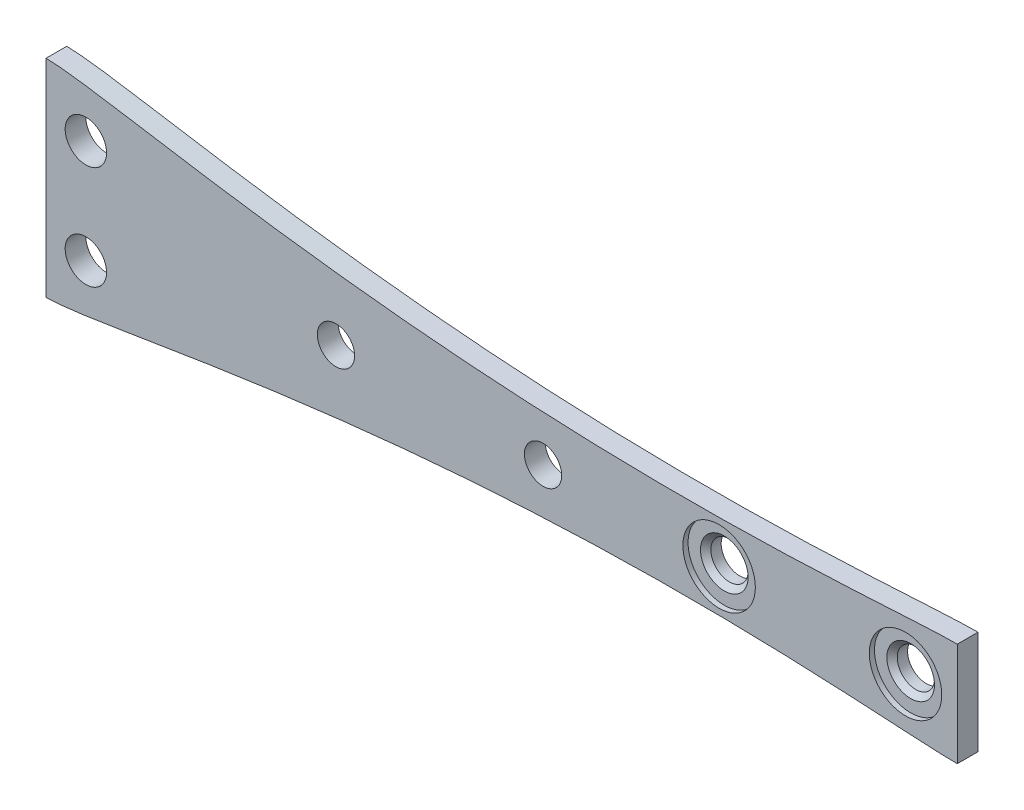
ISO-10303-21;
HEADER;
FILE_DESCRIPTION(('STEP AP214'),'2;1');
FILE_NAME('part.step','',(''),(''),'','','');
FILE_SCHEMA(('AUTOMOTIVE_DESIGN { 1 0 10303 214 1 1 1 1 }'));
ENDSEC;
DATA;
#1=APPLICATION_CONTEXT('core data for automotive mechanical design processes');
#2=APPLICATION_PROTOCOL_DEFINITION('international standard','automotive_design',2000,#1);
#3=PRODUCT_CONTEXT('',#1,'mechanical');
#4=PRODUCT('Part','Part','',(#3));
#5=PRODUCT_RELATED_PRODUCT_CATEGORY('part','',(#4));
#6=PRODUCT_DEFINITION_FORMATION('','',#4);
#7=PRODUCT_DEFINITION_CONTEXT('part definition',#1,'design');
#8=PRODUCT_DEFINITION('design','',#6,#7);
#9=PRODUCT_DEFINITION_SHAPE('','',#8);
#10=(LENGTH_UNIT() NAMED_UNIT(*) SI_UNIT(.MILLI.,.METRE.));
#11=(NAMED_UNIT(*) PLANE_ANGLE_UNIT() SI_UNIT($,.RADIAN.));
#12=(NAMED_UNIT(*) SI_UNIT($,.STERADIAN.) SOLID_ANGLE_UNIT());
#13=UNCERTAINTY_MEASURE_WITH_UNIT(LENGTH_MEASURE(1.E-05),#10,'distance_accuracy_value','');
#14=(GEOMETRIC_REPRESENTATION_CONTEXT(3) GLOBAL_UNCERTAINTY_ASSIGNED_CONTEXT((#13)) GLOBAL_UNIT_ASSIGNED_CONTEXT((#10,
#11,#12)) REPRESENTATION_CONTEXT('',''));
#15=CARTESIAN_POINT('',(0.,0.,0.));
#16=DIRECTION('',(0.,0.,1.));
#17=DIRECTION('',(1.,0.,0.));
#18=AXIS2_PLACEMENT_3D('',#15,#16,#17);
#19=CARTESIAN_POINT('',(65.,10.,2.));
#20=DIRECTION('',(0.,0.,-1.));
#21=DIRECTION('',(-1.,0.,0.));
#22=AXIS2_PLACEMENT_3D('',#19,#20,#21);
#23=CYLINDRICAL_SURFACE('',#22,1.79999999999999);
#24=CARTESIAN_POINT('',(65.,10.,1.));
#25=DIRECTION('',(0.,0.,1.));
#26=DIRECTION('',(1.,0.,0.));
#27=AXIS2_PLACEMENT_3D('',#24,#25,#26);
#28=CIRCLE('',#27,1.79999999999999);
#29=CARTESIAN_POINT('',(66.8,10.,1.));
#30=VERTEX_POINT('',#29);
#31=EDGE_CURVE('E57',#30,#30,#28,.T.);
#32=ORIENTED_EDGE('',*,*,#31,.T.);
#33=EDGE_LOOP('',(#32));
#34=FACE_BOUND('',#33,.T.);
#35=CARTESIAN_POINT('',(65.,10.,0.));
#36=DIRECTION('',(0.,0.,1.));
#37=DIRECTION('',(1.,0.,0.));
#38=AXIS2_PLACEMENT_3D('',#35,#36,#37);
#39=CIRCLE('',#38,1.79999999999999);
#40=CARTESIAN_POINT('',(66.8,10.,0.));
#41=VERTEX_POINT('',#40);
#42=EDGE_CURVE('E214',#41,#41,#39,.T.);
#43=ORIENTED_EDGE('',*,*,#42,.F.);
#44=EDGE_LOOP('',(#43));
#45=FACE_BOUND('',#44,.T.);
#46=ADVANCED_FACE('F46',(#34,#45),#23,.F.);
#47=CARTESIAN_POINT('',(83.,10.,2.));
#48=DIRECTION('',(0.,0.,-1.));
#49=DIRECTION('',(-1.,0.,0.));
#50=AXIS2_PLACEMENT_3D('',#47,#48,#49);
#51=CYLINDRICAL_SURFACE('',#50,1.79999999999999);
#52=CARTESIAN_POINT('',(83.,10.,1.));
#53=DIRECTION('',(0.,0.,1.));
#54=DIRECTION('',(1.,0.,0.));
#55=AXIS2_PLACEMENT_3D('',#52,#53,#54);
#56=CIRCLE('',#55,1.79999999999999);
#57=CARTESIAN_POINT('',(84.8,10.,1.));
#58=VERTEX_POINT('',#57);
#59=EDGE_CURVE('E229',#58,#58,#56,.T.);
#60=ORIENTED_EDGE('',*,*,#59,.T.);
#61=EDGE_LOOP('',(#60));
#62=FACE_BOUND('',#61,.T.);
#63=CARTESIAN_POINT('',(83.,10.,0.));
#64=DIRECTION('',(0.,0.,1.));
#65=DIRECTION('',(1.,0.,0.));
#66=AXIS2_PLACEMENT_3D('',#63,#64,#65);
#67=CIRCLE('',#66,1.79999999999999);
#68=CARTESIAN_POINT('',(84.8,10.,0.));
#69=VERTEX_POINT('',#68);
#70=EDGE_CURVE('E218',#69,#69,#67,.T.);
#71=ORIENTED_EDGE('',*,*,#70,.F.);
#72=EDGE_LOOP('',(#71));
#73=FACE_BOUND('',#72,.T.);
#74=ADVANCED_FACE('F146',(#62,#73),#51,.F.);
#75=CARTESIAN_POINT('',(88.,0.,2.));
#76=DIRECTION('',(1.,0.,0.));
#77=DIRECTION('',(0.,0.,-1.));
#78=AXIS2_PLACEMENT_3D('',#75,#76,#77);
#79=PLANE('',#78);
#80=DIRECTION('',(0.,-1.,0.));
#81=VECTOR('',#80,1.);
#82=CARTESIAN_POINT('',(88.,0.,0.));
#83=LINE('',#82,#81);
#84=CARTESIAN_POINT('',(88.,15.,0.));
#85=VERTEX_POINT('',#84);
#86=CARTESIAN_POINT('',(88.,5.00000000000002,0.));
#87=VERTEX_POINT('',#86);
#88=EDGE_CURVE('E299',#85,#87,#83,.T.);
#89=ORIENTED_EDGE('',*,*,#88,.F.);
#90=DIRECTION('',(0.,0.,-1.));
#91=VECTOR('',#90,1.);
#92=CARTESIAN_POINT('',(88.,15.,2.));
#93=LINE('',#92,#91);
#94=CARTESIAN_POINT('',(88.,15.,2.));
#95=VERTEX_POINT('',#94);
#96=EDGE_CURVE('E91',#95,#85,#93,.T.);
#97=ORIENTED_EDGE('',*,*,#96,.F.);
#98=DIRECTION('',(0.,-1.,0.));
#99=VECTOR('',#98,1.);
#100=CARTESIAN_POINT('',(88.,0.,2.));
#101=LINE('',#100,#99);
#102=CARTESIAN_POINT('',(88.,5.00000000000002,2.));
#103=VERTEX_POINT('',#102);
#104=EDGE_CURVE('E111',#95,#103,#101,.T.);
#105=ORIENTED_EDGE('',*,*,#104,.T.);
#106=DIRECTION('',(0.,0.,-1.));
#107=VECTOR('',#106,1.);
#108=CARTESIAN_POINT('',(88.,5.00000000000002,2.));
#109=LINE('',#108,#107);
#110=EDGE_CURVE('E88',#103,#87,#109,.T.);
#111=ORIENTED_EDGE('',*,*,#110,.T.);
#112=EDGE_LOOP('',(#89,#97,#105,#111));
#113=FACE_BOUND('',#112,.T.);
#114=ADVANCED_FACE('F144',(#113),#79,.T.);
#115=CARTESIAN_POINT('',(0.,20.,2.));
#116=CARTESIAN_POINT('',(8.,20.,2.));
#117=CARTESIAN_POINT('',(43.,10.,2.));
#118=CARTESIAN_POINT('',(78.,15.,2.));
#119=CARTESIAN_POINT('',(88.,15.,2.));
#120=B_SPLINE_CURVE_WITH_KNOTS('',4,(#115,#116,#117,#118,#119),.UNSPECIFIED.,.F.,.F.,(5,5),(0.,
1.),.UNSPECIFIED.);
#121=DIRECTION('',(0.,0.,-1.));
#122=VECTOR('',#121,1.);
#123=SURFACE_OF_LINEAR_EXTRUSION('',#120,#122);
#124=CARTESIAN_POINT('',(0.,20.,0.));
#125=CARTESIAN_POINT('',(8.,20.,0.));
#126=CARTESIAN_POINT('',(43.,10.,0.));
#127=CARTESIAN_POINT('',(78.,15.,0.));
#128=CARTESIAN_POINT('',(88.,15.,0.));
#129=B_SPLINE_CURVE_WITH_KNOTS('',4,(#124,#125,#126,#127,#128),.UNSPECIFIED.,.F.,.F.,(5,5),(0.,
1.),.UNSPECIFIED.);
#130=CARTESIAN_POINT('',(0.,20.,0.));
#131=VERTEX_POINT('',#130);
#132=EDGE_CURVE('E101',#131,#85,#129,.T.);
#133=ORIENTED_EDGE('',*,*,#132,.F.);
#134=DIRECTION('',(0.,0.,-1.));
#135=VECTOR('',#134,1.);
#136=CARTESIAN_POINT('',(0.,20.,2.));
#137=LINE('',#136,#135);
#138=CARTESIAN_POINT('',(0.,20.,2.));
#139=VERTEX_POINT('',#138);
#140=EDGE_CURVE('E96',#139,#131,#137,.T.);
#141=ORIENTED_EDGE('',*,*,#140,.F.);
#142=EDGE_CURVE('E99',#139,#95,#120,.T.);
#143=ORIENTED_EDGE('',*,*,#142,.T.);
#144=ORIENTED_EDGE('',*,*,#96,.T.);
#145=EDGE_LOOP('',(#133,#141,#143,#144));
#146=FACE_BOUND('',#145,.T.);
#147=ADVANCED_FACE('F98',(#146),#123,.T.);
#148=CARTESIAN_POINT('',(0.,0.,2.));
#149=DIRECTION('',(-1.,0.,0.));
#150=DIRECTION('',(0.,0.,1.));
#151=AXIS2_PLACEMENT_3D('',#148,#149,#150);
#152=PLANE('',#151);
#153=DIRECTION('',(0.,1.,0.));
#154=VECTOR('',#153,1.);
#155=CARTESIAN_POINT('',(0.,0.,0.));
#156=LINE('',#155,#154);
#157=CARTESIAN_POINT('',(0.,0.,0.));
#158=VERTEX_POINT('',#157);
#159=EDGE_CURVE('E310',#158,#131,#156,.T.);
#160=ORIENTED_EDGE('',*,*,#159,.F.);
#161=DIRECTION('',(0.,0.,-1.));
#162=VECTOR('',#161,1.);
#163=CARTESIAN_POINT('',(0.,0.,2.));
#164=LINE('',#163,#162);
#165=CARTESIAN_POINT('',(0.,0.,2.));
#166=VERTEX_POINT('',#165);
#167=EDGE_CURVE('E81',#166,#158,#164,.T.);
#168=ORIENTED_EDGE('',*,*,#167,.F.);
#169=DIRECTION('',(0.,1.,0.));
#170=VECTOR('',#169,1.);
#171=CARTESIAN_POINT('',(0.,0.,2.));
#172=LINE('',#171,#170);
#173=EDGE_CURVE('E110',#166,#139,#172,.T.);
#174=ORIENTED_EDGE('',*,*,#173,.T.);
#175=ORIENTED_EDGE('',*,*,#140,.T.);
#176=EDGE_LOOP('',(#160,#168,#174,#175));
#177=FACE_BOUND('',#176,.T.);
#178=ADVANCED_FACE('F114',(#177),#152,.T.);
#179=CARTESIAN_POINT('',(28.,10.,2.));
#180=DIRECTION('',(0.,0.,-1.));
#181=DIRECTION('',(-1.,0.,0.));
#182=AXIS2_PLACEMENT_3D('',#179,#180,#181);
#183=CYLINDRICAL_SURFACE('',#182,1.8);
#184=CARTESIAN_POINT('',(28.,10.,2.));
#185=DIRECTION('',(0.,0.,1.));
#186=DIRECTION('',(1.,0.,0.));
#187=AXIS2_PLACEMENT_3D('',#184,#185,#186);
#188=CIRCLE('',#187,1.8);
#189=CARTESIAN_POINT('',(29.8,10.,2.));
#190=VERTEX_POINT('',#189);
#191=EDGE_CURVE('E224',#190,#190,#188,.T.);
#192=ORIENTED_EDGE('',*,*,#191,.T.);
#193=EDGE_LOOP('',(#192));
#194=FACE_BOUND('',#193,.T.);
#195=CARTESIAN_POINT('',(28.,10.,0.));
#196=DIRECTION('',(0.,0.,1.));
#197=DIRECTION('',(1.,0.,0.));
#198=AXIS2_PLACEMENT_3D('',#195,#196,#197);
#199=CIRCLE('',#198,1.8);
#200=CARTESIAN_POINT('',(29.8,10.,0.));
#201=VERTEX_POINT('',#200);
#202=EDGE_CURVE('E204',#201,#201,#199,.T.);
#203=ORIENTED_EDGE('',*,*,#202,.F.);
#204=EDGE_LOOP('',(#203));
#205=FACE_BOUND('',#204,.T.);
#206=ADVANCED_FACE('F141',(#194,#205),#183,.F.);
#207=CARTESIAN_POINT('',(48.,9.99999999999998,2.));
#208=DIRECTION('',(0.,0.,-1.));
#209=DIRECTION('',(-1.,0.,0.));
#210=AXIS2_PLACEMENT_3D('',#207,#208,#209);
#211=CYLINDRICAL_SURFACE('',#210,1.8);
#212=CARTESIAN_POINT('',(48.,9.99999999999998,2.));
#213=DIRECTION('',(0.,0.,1.));
#214=DIRECTION('',(1.,0.,0.));
#215=AXIS2_PLACEMENT_3D('',#212,#213,#214);
#216=CIRCLE('',#215,1.8);
#217=CARTESIAN_POINT('',(49.8,9.99999999999998,2.));
#218=VERTEX_POINT('',#217);
#219=EDGE_CURVE('E242',#218,#218,#216,.T.);
#220=ORIENTED_EDGE('',*,*,#219,.T.);
#221=EDGE_LOOP('',(#220));
#222=FACE_BOUND('',#221,.T.);
#223=CARTESIAN_POINT('',(48.,9.99999999999998,0.));
#224=DIRECTION('',(0.,0.,1.));
#225=DIRECTION('',(1.,0.,0.));
#226=AXIS2_PLACEMENT_3D('',#223,#224,#225);
#227=CIRCLE('',#226,1.8);
#228=CARTESIAN_POINT('',(49.8,9.99999999999998,0.));
#229=VERTEX_POINT('',#228);
#230=EDGE_CURVE('E198',#229,#229,#227,.T.);
#231=ORIENTED_EDGE('',*,*,#230,.F.);
#232=EDGE_LOOP('',(#231));
#233=FACE_BOUND('',#232,.T.);
#234=ADVANCED_FACE('F178',(#222,#233),#211,.F.);
#235=CARTESIAN_POINT('',(3.85,15.,2.));
#236=DIRECTION('',(0.,0.,-1.));
#237=DIRECTION('',(-1.,0.,0.));
#238=AXIS2_PLACEMENT_3D('',#235,#236,#237);
#239=CYLINDRICAL_SURFACE('',#238,2.);
#240=CARTESIAN_POINT('',(3.85,15.,2.));
#241=DIRECTION('',(0.,0.,1.));
#242=DIRECTION('',(1.,0.,0.));
#243=AXIS2_PLACEMENT_3D('',#240,#241,#242);
#244=CIRCLE('',#243,2.);
#245=CARTESIAN_POINT('',(5.85,15.,2.));
#246=VERTEX_POINT('',#245);
#247=EDGE_CURVE('E192',#246,#246,#244,.T.);
#248=ORIENTED_EDGE('',*,*,#247,.T.);
#249=EDGE_LOOP('',(#248));
#250=FACE_BOUND('',#249,.T.);
#251=CARTESIAN_POINT('',(3.85,15.,0.));
#252=DIRECTION('',(0.,0.,1.));
#253=DIRECTION('',(1.,0.,0.));
#254=AXIS2_PLACEMENT_3D('',#251,#252,#253);
#255=CIRCLE('',#254,2.);
#256=CARTESIAN_POINT('',(5.85,15.,0.));
#257=VERTEX_POINT('',#256);
#258=EDGE_CURVE('E195',#257,#257,#255,.T.);
#259=ORIENTED_EDGE('',*,*,#258,.F.);
#260=EDGE_LOOP('',(#259));
#261=FACE_BOUND('',#260,.T.);
#262=ADVANCED_FACE('F181',(#250,#261),#239,.F.);
#263=CARTESIAN_POINT('',(3.85,5.,2.));
#264=DIRECTION('',(0.,0.,-1.));
#265=DIRECTION('',(-1.,0.,0.));
#266=AXIS2_PLACEMENT_3D('',#263,#264,#265);
#267=CYLINDRICAL_SURFACE('',#266,2.);
#268=CARTESIAN_POINT('',(3.85,5.,2.));
#269=DIRECTION('',(0.,0.,1.));
#270=DIRECTION('',(1.,0.,0.));
#271=AXIS2_PLACEMENT_3D('',#268,#269,#270);
#272=CIRCLE('',#271,2.);
#273=CARTESIAN_POINT('',(5.85,5.,2.));
#274=VERTEX_POINT('',#273);
#275=EDGE_CURVE('E118',#274,#274,#272,.T.);
#276=ORIENTED_EDGE('',*,*,#275,.T.);
#277=EDGE_LOOP('',(#276));
#278=FACE_BOUND('',#277,.T.);
#279=CARTESIAN_POINT('',(3.85,5.,0.));
#280=DIRECTION('',(0.,0.,1.));
#281=DIRECTION('',(1.,0.,0.));
#282=AXIS2_PLACEMENT_3D('',#279,#280,#281);
#283=CIRCLE('',#282,2.);
#284=CARTESIAN_POINT('',(5.85,5.,0.));
#285=VERTEX_POINT('',#284);
#286=EDGE_CURVE('E199',#285,#285,#283,.T.);
#287=ORIENTED_EDGE('',*,*,#286,.F.);
#288=EDGE_LOOP('',(#287));
#289=FACE_BOUND('',#288,.T.);
#290=ADVANCED_FACE('F137',(#278,#289),#267,.F.);
#291=CARTESIAN_POINT('',(0.,0.,2.));
#292=CARTESIAN_POINT('',(8.00000000000001,0.,2.));
#293=CARTESIAN_POINT('',(43.,10.,2.));
#294=CARTESIAN_POINT('',(78.,5.00000000000001,2.));
#295=CARTESIAN_POINT('',(88.,5.00000000000002,2.));
#296=B_SPLINE_CURVE_WITH_KNOTS('',4,(#291,#292,#293,#294,#295),.UNSPECIFIED.,.F.,.F.,(5,5),(0.,
1.),.UNSPECIFIED.);
#297=DIRECTION('',(0.,0.,-1.));
#298=VECTOR('',#297,1.);
#299=SURFACE_OF_LINEAR_EXTRUSION('',#296,#298);
#300=CARTESIAN_POINT('',(0.,0.,0.));
#301=CARTESIAN_POINT('',(8.00000000000001,0.,0.));
#302=CARTESIAN_POINT('',(43.,10.,0.));
#303=CARTESIAN_POINT('',(78.,5.00000000000001,0.));
#304=CARTESIAN_POINT('',(88.,5.00000000000002,0.));
#305=B_SPLINE_CURVE_WITH_KNOTS('',4,(#300,#301,#302,#303,#304),.UNSPECIFIED.,.F.,.F.,(5,5),(0.,
1.),.UNSPECIFIED.);
#306=EDGE_CURVE('E207',#158,#87,#305,.T.);
#307=ORIENTED_EDGE('',*,*,#306,.T.);
#308=ORIENTED_EDGE('',*,*,#110,.F.);
#309=EDGE_CURVE('E65',#166,#103,#296,.T.);
#310=ORIENTED_EDGE('',*,*,#309,.F.);
#311=ORIENTED_EDGE('',*,*,#167,.T.);
#312=EDGE_LOOP('',(#307,#308,#310,#311));
#313=FACE_BOUND('',#312,.T.);
#314=ADVANCED_FACE('F133',(#313),#299,.F.);
#315=CARTESIAN_POINT('',(0.,0.,2.));
#316=DIRECTION('',(0.,0.,1.));
#317=DIRECTION('',(1.,0.,0.));
#318=AXIS2_PLACEMENT_3D('',#315,#316,#317);
#319=PLANE('',#318);
#320=CARTESIAN_POINT('',(65.,10.,2.));
#321=DIRECTION('',(0.,0.,1.));
#322=DIRECTION('',(1.,0.,0.));
#323=AXIS2_PLACEMENT_3D('',#320,#321,#322);
#324=CIRCLE('',#323,3.50000000000001);
#325=CARTESIAN_POINT('',(68.5,10.,2.));
#326=VERTEX_POINT('',#325);
#327=EDGE_CURVE('E293',#326,#326,#324,.T.);
#328=ORIENTED_EDGE('',*,*,#327,.F.);
#329=EDGE_LOOP('',(#328));
#330=FACE_BOUND('',#329,.T.);
#331=CARTESIAN_POINT('',(83.,10.,2.));
#332=DIRECTION('',(0.,0.,1.));
#333=DIRECTION('',(1.,0.,0.));
#334=AXIS2_PLACEMENT_3D('',#331,#332,#333);
#335=CIRCLE('',#334,3.50000000000001);
#336=CARTESIAN_POINT('',(86.5,10.,2.));
#337=VERTEX_POINT('',#336);
#338=EDGE_CURVE('E295',#337,#337,#335,.T.);
#339=ORIENTED_EDGE('',*,*,#338,.F.);
#340=EDGE_LOOP('',(#339));
#341=FACE_BOUND('',#340,.T.);
#342=ORIENTED_EDGE('',*,*,#104,.F.);
#343=ORIENTED_EDGE('',*,*,#142,.F.);
#344=ORIENTED_EDGE('',*,*,#173,.F.);
#345=ORIENTED_EDGE('',*,*,#309,.T.);
#346=EDGE_LOOP('',(#342,#343,#344,#345));
#347=FACE_BOUND('',#346,.T.);
#348=ORIENTED_EDGE('',*,*,#275,.F.);
#349=EDGE_LOOP('',(#348));
#350=FACE_BOUND('',#349,.T.);
#351=ORIENTED_EDGE('',*,*,#247,.F.);
#352=EDGE_LOOP('',(#351));
#353=FACE_BOUND('',#352,.T.);
#354=ORIENTED_EDGE('',*,*,#219,.F.);
#355=EDGE_LOOP('',(#354));
#356=FACE_BOUND('',#355,.T.);
#357=ORIENTED_EDGE('',*,*,#191,.F.);
#358=EDGE_LOOP('',(#357));
#359=FACE_BOUND('',#358,.T.);
#360=ADVANCED_FACE('F108',(#330,#341,#347,#350,#353,#356,#359),#319,.T.);
#361=CARTESIAN_POINT('',(0.,0.,0.));
#362=DIRECTION('',(0.,0.,1.));
#363=DIRECTION('',(1.,0.,0.));
#364=AXIS2_PLACEMENT_3D('',#361,#362,#363);
#365=PLANE('',#364);
#366=ORIENTED_EDGE('',*,*,#88,.T.);
#367=ORIENTED_EDGE('',*,*,#306,.F.);
#368=ORIENTED_EDGE('',*,*,#159,.T.);
#369=ORIENTED_EDGE('',*,*,#132,.T.);
#370=EDGE_LOOP('',(#366,#367,#368,#369));
#371=FACE_BOUND('',#370,.T.);
#372=ORIENTED_EDGE('',*,*,#286,.T.);
#373=EDGE_LOOP('',(#372));
#374=FACE_BOUND('',#373,.T.);
#375=ORIENTED_EDGE('',*,*,#258,.T.);
#376=EDGE_LOOP('',(#375));
#377=FACE_BOUND('',#376,.T.);
#378=ORIENTED_EDGE('',*,*,#230,.T.);
#379=EDGE_LOOP('',(#378));
#380=FACE_BOUND('',#379,.T.);
#381=ORIENTED_EDGE('',*,*,#202,.T.);
#382=EDGE_LOOP('',(#381));
#383=FACE_BOUND('',#382,.T.);
#384=ORIENTED_EDGE('',*,*,#42,.T.);
#385=EDGE_LOOP('',(#384));
#386=FACE_BOUND('',#385,.T.);
#387=ORIENTED_EDGE('',*,*,#70,.T.);
#388=EDGE_LOOP('',(#387));
#389=FACE_BOUND('',#388,.T.);
#390=ADVANCED_FACE('F253',(#371,#374,#377,#380,#383,#386,#389),#365,.F.);
#391=CARTESIAN_POINT('',(83.,10.,1.5));
#392=DIRECTION('',(0.,0.,1.));
#393=DIRECTION('',(1.,0.,0.));
#394=AXIS2_PLACEMENT_3D('',#391,#392,#393);
#395=CYLINDRICAL_SURFACE('',#394,3.50000000000001);
#396=CARTESIAN_POINT('',(83.,10.,1.5));
#397=DIRECTION('',(0.,0.,1.));
#398=DIRECTION('',(1.,0.,0.));
#399=AXIS2_PLACEMENT_3D('',#396,#397,#398);
#400=CIRCLE('',#399,3.50000000000001);
#401=CARTESIAN_POINT('',(86.5,10.,1.5));
#402=VERTEX_POINT('',#401);
#403=EDGE_CURVE('E302',#402,#402,#400,.T.);
#404=ORIENTED_EDGE('',*,*,#403,.F.);
#405=EDGE_LOOP('',(#404));
#406=FACE_BOUND('',#405,.T.);
#407=ORIENTED_EDGE('',*,*,#338,.T.);
#408=EDGE_LOOP('',(#407));
#409=FACE_BOUND('',#408,.T.);
#410=ADVANCED_FACE('F265',(#406,#409),#395,.F.);
#411=CARTESIAN_POINT('',(83.,10.,1.5));
#412=DIRECTION('',(0.,0.,1.));
#413=DIRECTION('',(1.,0.,0.));
#414=AXIS2_PLACEMENT_3D('',#411,#412,#413);
#415=PLANE('',#414);
#416=CARTESIAN_POINT('',(83.,10.,1.5));
#417=DIRECTION('',(0.,0.,1.));
#418=DIRECTION('',(1.,0.,0.));
#419=AXIS2_PLACEMENT_3D('',#416,#417,#418);
#420=CIRCLE('',#419,2.30000000000001);
#421=CARTESIAN_POINT('',(85.3,10.,1.5));
#422=VERTEX_POINT('',#421);
#423=EDGE_CURVE('E233',#422,#422,#420,.F.);
#424=ORIENTED_EDGE('',*,*,#423,.T.);
#425=EDGE_LOOP('',(#424));
#426=FACE_BOUND('',#425,.T.);
#427=ORIENTED_EDGE('',*,*,#403,.T.);
#428=EDGE_LOOP('',(#427));
#429=FACE_BOUND('',#428,.T.);
#430=ADVANCED_FACE('F274',(#426,#429),#415,.T.);
#431=CARTESIAN_POINT('',(65.,10.,1.5));
#432=DIRECTION('',(0.,0.,1.));
#433=DIRECTION('',(1.,0.,0.));
#434=AXIS2_PLACEMENT_3D('',#431,#432,#433);
#435=CYLINDRICAL_SURFACE('',#434,3.50000000000001);
#436=CARTESIAN_POINT('',(65.,10.,1.5));
#437=DIRECTION('',(0.,0.,1.));
#438=DIRECTION('',(1.,0.,0.));
#439=AXIS2_PLACEMENT_3D('',#436,#437,#438);
#440=CIRCLE('',#439,3.50000000000001);
#441=CARTESIAN_POINT('',(68.5,10.,1.5));
#442=VERTEX_POINT('',#441);
#443=EDGE_CURVE('E290',#442,#442,#440,.T.);
#444=ORIENTED_EDGE('',*,*,#443,.F.);
#445=EDGE_LOOP('',(#444));
#446=FACE_BOUND('',#445,.T.);
#447=ORIENTED_EDGE('',*,*,#327,.T.);
#448=EDGE_LOOP('',(#447));
#449=FACE_BOUND('',#448,.T.);
#450=ADVANCED_FACE('F159',(#446,#449),#435,.F.);
#451=CARTESIAN_POINT('',(65.,10.,1.5));
#452=DIRECTION('',(0.,0.,1.));
#453=DIRECTION('',(1.,0.,0.));
#454=AXIS2_PLACEMENT_3D('',#451,#452,#453);
#455=PLANE('',#454);
#456=CARTESIAN_POINT('',(65.,10.,1.5));
#457=DIRECTION('',(0.,0.,1.));
#458=DIRECTION('',(1.,0.,0.));
#459=AXIS2_PLACEMENT_3D('',#456,#457,#458);
#460=CIRCLE('',#459,2.30000000000001);
#461=CARTESIAN_POINT('',(67.3,10.,1.5));
#462=VERTEX_POINT('',#461);
#463=EDGE_CURVE('E11',#462,#462,#460,.F.);
#464=ORIENTED_EDGE('',*,*,#463,.T.);
#465=EDGE_LOOP('',(#464));
#466=FACE_BOUND('',#465,.T.);
#467=ORIENTED_EDGE('',*,*,#443,.T.);
#468=EDGE_LOOP('',(#467));
#469=FACE_BOUND('',#468,.T.);
#470=ADVANCED_FACE('F152',(#466,#469),#455,.T.);
#471=CARTESIAN_POINT('',(83.,10.,1.));
#472=DIRECTION('',(0.,0.,1.));
#473=DIRECTION('',(1.,0.,0.));
#474=AXIS2_PLACEMENT_3D('',#471,#472,#473);
#475=CONICAL_SURFACE('',#474,1.79999999999999,0.785398163397469);
#476=ORIENTED_EDGE('',*,*,#423,.F.);
#477=EDGE_LOOP('',(#476));
#478=FACE_BOUND('',#477,.T.);
#479=ORIENTED_EDGE('',*,*,#59,.F.);
#480=EDGE_LOOP('',(#479));
#481=FACE_BOUND('',#480,.T.);
#482=ADVANCED_FACE('F148',(#478,#481),#475,.F.);
#483=CARTESIAN_POINT('',(65.,10.,1.));
#484=DIRECTION('',(0.,0.,1.));
#485=DIRECTION('',(1.,0.,0.));
#486=AXIS2_PLACEMENT_3D('',#483,#484,#485);
#487=CONICAL_SURFACE('',#486,1.79999999999999,0.785398163397469);
#488=ORIENTED_EDGE('',*,*,#463,.F.);
#489=EDGE_LOOP('',(#488));
#490=FACE_BOUND('',#489,.T.);
#491=ORIENTED_EDGE('',*,*,#31,.F.);
#492=EDGE_LOOP('',(#491));
#493=FACE_BOUND('',#492,.T.);
#494=ADVANCED_FACE('F49',(#490,#493),#487,.F.);
#495=CLOSED_SHELL('',(#46,#74,#114,#147,#178,#206,#234,#262,#290,#314,#360,#390,#410,#430,#450,
#470,#482,#494));
#496=MANIFOLD_SOLID_BREP('B2',#495);
#497=ADVANCED_BREP_SHAPE_REPRESENTATION('',(#18,#496),#14);
#498=SHAPE_DEFINITION_REPRESENTATION(#9,#497);
ENDSEC;
END-ISO-10303-21;
